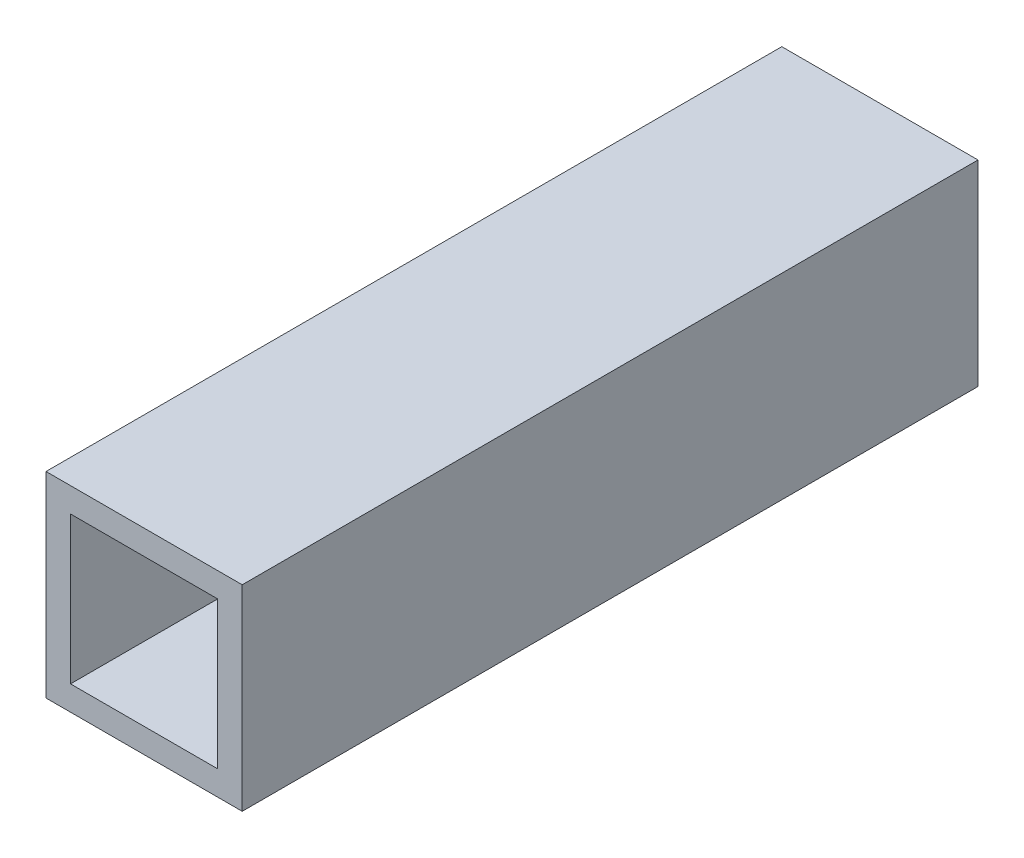
ISO-10303-21;
HEADER;
FILE_DESCRIPTION(('STEP AP214'),'2;1');
FILE_NAME('part.step','',(''),(''),'','','');
FILE_SCHEMA(('AUTOMOTIVE_DESIGN { 1 0 10303 214 1 1 1 1 }'));
ENDSEC;
DATA;
#1=APPLICATION_CONTEXT('core data for automotive mechanical design processes');
#2=APPLICATION_PROTOCOL_DEFINITION('international standard','automotive_design',2000,#1);
#3=PRODUCT_CONTEXT('',#1,'mechanical');
#4=PRODUCT('Part','Part','',(#3));
#5=PRODUCT_RELATED_PRODUCT_CATEGORY('part','',(#4));
#6=PRODUCT_DEFINITION_FORMATION('','',#4);
#7=PRODUCT_DEFINITION_CONTEXT('part definition',#1,'design');
#8=PRODUCT_DEFINITION('design','',#6,#7);
#9=PRODUCT_DEFINITION_SHAPE('','',#8);
#10=(LENGTH_UNIT() NAMED_UNIT(*) SI_UNIT(.MILLI.,.METRE.));
#11=(NAMED_UNIT(*) PLANE_ANGLE_UNIT() SI_UNIT($,.RADIAN.));
#12=(NAMED_UNIT(*) SI_UNIT($,.STERADIAN.) SOLID_ANGLE_UNIT());
#13=UNCERTAINTY_MEASURE_WITH_UNIT(LENGTH_MEASURE(1.E-05),#10,'distance_accuracy_value','');
#14=(GEOMETRIC_REPRESENTATION_CONTEXT(3) GLOBAL_UNCERTAINTY_ASSIGNED_CONTEXT((#13)) GLOBAL_UNIT_ASSIGNED_CONTEXT((#10,
#11,#12)) REPRESENTATION_CONTEXT('',''));
#15=CARTESIAN_POINT('',(0.,0.,0.));
#16=DIRECTION('',(0.,0.,1.));
#17=DIRECTION('',(1.,0.,0.));
#18=AXIS2_PLACEMENT_3D('',#15,#16,#17);
#19=CARTESIAN_POINT('',(0.,0.,95.25));
#20=DIRECTION('',(0.,0.,1.));
#21=DIRECTION('',(1.,0.,0.));
#22=AXIS2_PLACEMENT_3D('',#19,#20,#21);
#23=PLANE('',#22);
#24=DIRECTION('',(0.,-1.,0.));
#25=VECTOR('',#24,1.);
#26=CARTESIAN_POINT('',(-12.7,-12.7,95.25));
#27=LINE('',#26,#25);
#28=CARTESIAN_POINT('',(-12.7,12.7,95.25));
#29=VERTEX_POINT('',#28);
#30=CARTESIAN_POINT('',(-12.7,-12.7,95.25));
#31=VERTEX_POINT('',#30);
#32=EDGE_CURVE('E133',#29,#31,#27,.T.);
#33=ORIENTED_EDGE('',*,*,#32,.T.);
#34=DIRECTION('',(1.,0.,0.));
#35=VECTOR('',#34,1.);
#36=CARTESIAN_POINT('',(12.7,-12.7,95.25));
#37=LINE('',#36,#35);
#38=CARTESIAN_POINT('',(12.7,-12.7,95.25));
#39=VERTEX_POINT('',#38);
#40=EDGE_CURVE('E136',#31,#39,#37,.T.);
#41=ORIENTED_EDGE('',*,*,#40,.T.);
#42=DIRECTION('',(0.,1.,0.));
#43=VECTOR('',#42,1.);
#44=CARTESIAN_POINT('',(12.7,-12.7,95.25));
#45=LINE('',#44,#43);
#46=CARTESIAN_POINT('',(12.7,12.7,95.25));
#47=VERTEX_POINT('',#46);
#48=EDGE_CURVE('E139',#39,#47,#45,.T.);
#49=ORIENTED_EDGE('',*,*,#48,.T.);
#50=DIRECTION('',(-1.,0.,0.));
#51=VECTOR('',#50,1.);
#52=CARTESIAN_POINT('',(12.7,12.7,95.25));
#53=LINE('',#52,#51);
#54=EDGE_CURVE('E141',#47,#29,#53,.T.);
#55=ORIENTED_EDGE('',*,*,#54,.T.);
#56=EDGE_LOOP('',(#33,#41,#49,#55));
#57=FACE_BOUND('',#56,.T.);
#58=DIRECTION('',(1.,0.,0.));
#59=VECTOR('',#58,1.);
#60=CARTESIAN_POINT('',(9.525,-9.525,95.25));
#61=LINE('',#60,#59);
#62=CARTESIAN_POINT('',(-9.525,-9.525,95.25));
#63=VERTEX_POINT('',#62);
#64=CARTESIAN_POINT('',(9.525,-9.525,95.25));
#65=VERTEX_POINT('',#64);
#66=EDGE_CURVE('E105',#63,#65,#61,.T.);
#67=ORIENTED_EDGE('',*,*,#66,.F.);
#68=DIRECTION('',(0.,-1.,0.));
#69=VECTOR('',#68,1.);
#70=CARTESIAN_POINT('',(-9.525,-9.525,95.25));
#71=LINE('',#70,#69);
#72=CARTESIAN_POINT('',(-9.525,9.525,95.25));
#73=VERTEX_POINT('',#72);
#74=EDGE_CURVE('E97',#73,#63,#71,.T.);
#75=ORIENTED_EDGE('',*,*,#74,.F.);
#76=DIRECTION('',(-1.,0.,0.));
#77=VECTOR('',#76,1.);
#78=CARTESIAN_POINT('',(9.525,9.525,95.25));
#79=LINE('',#78,#77);
#80=CARTESIAN_POINT('',(9.525,9.525,95.25));
#81=VERTEX_POINT('',#80);
#82=EDGE_CURVE('E119',#81,#73,#79,.T.);
#83=ORIENTED_EDGE('',*,*,#82,.F.);
#84=DIRECTION('',(0.,1.,0.));
#85=VECTOR('',#84,1.);
#86=CARTESIAN_POINT('',(9.525,-9.525,95.25));
#87=LINE('',#86,#85);
#88=EDGE_CURVE('E117',#65,#81,#87,.T.);
#89=ORIENTED_EDGE('',*,*,#88,.F.);
#90=EDGE_LOOP('',(#67,#75,#83,#89));
#91=FACE_BOUND('',#90,.T.);
#92=ADVANCED_FACE('F32',(#57,#91),#23,.T.);
#93=CARTESIAN_POINT('',(0.,0.,0.));
#94=DIRECTION('',(0.,0.,1.));
#95=DIRECTION('',(1.,0.,0.));
#96=AXIS2_PLACEMENT_3D('',#93,#94,#95);
#97=PLANE('',#96);
#98=DIRECTION('',(0.,-1.,0.));
#99=VECTOR('',#98,1.);
#100=CARTESIAN_POINT('',(-12.7,-12.7,0.));
#101=LINE('',#100,#99);
#102=CARTESIAN_POINT('',(-12.7,12.7,0.));
#103=VERTEX_POINT('',#102);
#104=CARTESIAN_POINT('',(-12.7,-12.7,0.));
#105=VERTEX_POINT('',#104);
#106=EDGE_CURVE('E113',#103,#105,#101,.T.);
#107=ORIENTED_EDGE('',*,*,#106,.F.);
#108=DIRECTION('',(-1.,0.,0.));
#109=VECTOR('',#108,1.);
#110=CARTESIAN_POINT('',(12.7,12.7,0.));
#111=LINE('',#110,#109);
#112=CARTESIAN_POINT('',(12.7,12.7,0.));
#113=VERTEX_POINT('',#112);
#114=EDGE_CURVE('E137',#113,#103,#111,.T.);
#115=ORIENTED_EDGE('',*,*,#114,.F.);
#116=DIRECTION('',(0.,1.,0.));
#117=VECTOR('',#116,1.);
#118=CARTESIAN_POINT('',(12.7,-12.7,0.));
#119=LINE('',#118,#117);
#120=CARTESIAN_POINT('',(12.7,-12.7,0.));
#121=VERTEX_POINT('',#120);
#122=EDGE_CURVE('E148',#121,#113,#119,.T.);
#123=ORIENTED_EDGE('',*,*,#122,.F.);
#124=DIRECTION('',(1.,0.,0.));
#125=VECTOR('',#124,1.);
#126=CARTESIAN_POINT('',(12.7,-12.7,0.));
#127=LINE('',#126,#125);
#128=EDGE_CURVE('E146',#105,#121,#127,.T.);
#129=ORIENTED_EDGE('',*,*,#128,.F.);
#130=EDGE_LOOP('',(#107,#115,#123,#129));
#131=FACE_BOUND('',#130,.T.);
#132=DIRECTION('',(0.,-1.,0.));
#133=VECTOR('',#132,1.);
#134=CARTESIAN_POINT('',(-9.525,-9.525,0.));
#135=LINE('',#134,#133);
#136=CARTESIAN_POINT('',(-9.525,9.525,0.));
#137=VERTEX_POINT('',#136);
#138=CARTESIAN_POINT('',(-9.525,-9.525,0.));
#139=VERTEX_POINT('',#138);
#140=EDGE_CURVE('E55',#137,#139,#135,.T.);
#141=ORIENTED_EDGE('',*,*,#140,.T.);
#142=DIRECTION('',(1.,0.,0.));
#143=VECTOR('',#142,1.);
#144=CARTESIAN_POINT('',(9.525,-9.525,0.));
#145=LINE('',#144,#143);
#146=CARTESIAN_POINT('',(9.525,-9.525,0.));
#147=VERTEX_POINT('',#146);
#148=EDGE_CURVE('E112',#139,#147,#145,.T.);
#149=ORIENTED_EDGE('',*,*,#148,.T.);
#150=DIRECTION('',(0.,1.,0.));
#151=VECTOR('',#150,1.);
#152=CARTESIAN_POINT('',(9.525,-9.525,0.));
#153=LINE('',#152,#151);
#154=CARTESIAN_POINT('',(9.525,9.525,0.));
#155=VERTEX_POINT('',#154);
#156=EDGE_CURVE('E125',#147,#155,#153,.T.);
#157=ORIENTED_EDGE('',*,*,#156,.T.);
#158=DIRECTION('',(-1.,0.,0.));
#159=VECTOR('',#158,1.);
#160=CARTESIAN_POINT('',(9.525,9.525,0.));
#161=LINE('',#160,#159);
#162=EDGE_CURVE('E106',#155,#137,#161,.T.);
#163=ORIENTED_EDGE('',*,*,#162,.T.);
#164=EDGE_LOOP('',(#141,#149,#157,#163));
#165=FACE_BOUND('',#164,.T.);
#166=ADVANCED_FACE('F166',(#131,#165),#97,.F.);
#167=CARTESIAN_POINT('',(-12.7,-12.7,95.25));
#168=DIRECTION('',(1.,0.,0.));
#169=DIRECTION('',(0.,1.,0.));
#170=AXIS2_PLACEMENT_3D('',#167,#168,#169);
#171=PLANE('',#170);
#172=ORIENTED_EDGE('',*,*,#106,.T.);
#173=DIRECTION('',(0.,0.,-1.));
#174=VECTOR('',#173,1.);
#175=CARTESIAN_POINT('',(-12.7,-12.7,95.25));
#176=LINE('',#175,#174);
#177=EDGE_CURVE('E11',#31,#105,#176,.T.);
#178=ORIENTED_EDGE('',*,*,#177,.F.);
#179=ORIENTED_EDGE('',*,*,#32,.F.);
#180=DIRECTION('',(0.,0.,-1.));
#181=VECTOR('',#180,1.);
#182=CARTESIAN_POINT('',(-12.7,12.7,95.25));
#183=LINE('',#182,#181);
#184=EDGE_CURVE('E143',#29,#103,#183,.T.);
#185=ORIENTED_EDGE('',*,*,#184,.T.);
#186=EDGE_LOOP('',(#172,#178,#179,#185));
#187=FACE_BOUND('',#186,.T.);
#188=ADVANCED_FACE('F34',(#187),#171,.F.);
#189=CARTESIAN_POINT('',(12.7,-12.7,95.25));
#190=DIRECTION('',(0.,1.,0.));
#191=DIRECTION('',(0.,0.,1.));
#192=AXIS2_PLACEMENT_3D('',#189,#190,#191);
#193=PLANE('',#192);
#194=ORIENTED_EDGE('',*,*,#128,.T.);
#195=DIRECTION('',(0.,0.,-1.));
#196=VECTOR('',#195,1.);
#197=CARTESIAN_POINT('',(12.7,-12.7,95.25));
#198=LINE('',#197,#196);
#199=EDGE_CURVE('E40',#39,#121,#198,.T.);
#200=ORIENTED_EDGE('',*,*,#199,.F.);
#201=ORIENTED_EDGE('',*,*,#40,.F.);
#202=ORIENTED_EDGE('',*,*,#177,.T.);
#203=EDGE_LOOP('',(#194,#200,#201,#202));
#204=FACE_BOUND('',#203,.T.);
#205=ADVANCED_FACE('F176',(#204),#193,.F.);
#206=CARTESIAN_POINT('',(12.7,-12.7,95.25));
#207=DIRECTION('',(-1.,0.,0.));
#208=DIRECTION('',(0.,0.,1.));
#209=AXIS2_PLACEMENT_3D('',#206,#207,#208);
#210=PLANE('',#209);
#211=ORIENTED_EDGE('',*,*,#122,.T.);
#212=DIRECTION('',(0.,0.,-1.));
#213=VECTOR('',#212,1.);
#214=CARTESIAN_POINT('',(12.7,12.7,95.25));
#215=LINE('',#214,#213);
#216=EDGE_CURVE('E153',#47,#113,#215,.T.);
#217=ORIENTED_EDGE('',*,*,#216,.F.);
#218=ORIENTED_EDGE('',*,*,#48,.F.);
#219=ORIENTED_EDGE('',*,*,#199,.T.);
#220=EDGE_LOOP('',(#211,#217,#218,#219));
#221=FACE_BOUND('',#220,.T.);
#222=ADVANCED_FACE('F160',(#221),#210,.F.);
#223=CARTESIAN_POINT('',(12.7,12.7,95.25));
#224=DIRECTION('',(0.,-1.,0.));
#225=DIRECTION('',(1.,0.,0.));
#226=AXIS2_PLACEMENT_3D('',#223,#224,#225);
#227=PLANE('',#226);
#228=ORIENTED_EDGE('',*,*,#114,.T.);
#229=ORIENTED_EDGE('',*,*,#184,.F.);
#230=ORIENTED_EDGE('',*,*,#54,.F.);
#231=ORIENTED_EDGE('',*,*,#216,.T.);
#232=EDGE_LOOP('',(#228,#229,#230,#231));
#233=FACE_BOUND('',#232,.T.);
#234=ADVANCED_FACE('F170',(#233),#227,.F.);
#235=CARTESIAN_POINT('',(-9.525,-9.525,95.25));
#236=DIRECTION('',(1.,0.,0.));
#237=DIRECTION('',(0.,0.,-1.));
#238=AXIS2_PLACEMENT_3D('',#235,#236,#237);
#239=PLANE('',#238);
#240=ORIENTED_EDGE('',*,*,#140,.F.);
#241=DIRECTION('',(0.,0.,-1.));
#242=VECTOR('',#241,1.);
#243=CARTESIAN_POINT('',(-9.525,9.525,95.25));
#244=LINE('',#243,#242);
#245=EDGE_CURVE('E101',#73,#137,#244,.T.);
#246=ORIENTED_EDGE('',*,*,#245,.F.);
#247=ORIENTED_EDGE('',*,*,#74,.T.);
#248=DIRECTION('',(0.,0.,-1.));
#249=VECTOR('',#248,1.);
#250=CARTESIAN_POINT('',(-9.525,-9.525,95.25));
#251=LINE('',#250,#249);
#252=EDGE_CURVE('E100',#63,#139,#251,.T.);
#253=ORIENTED_EDGE('',*,*,#252,.T.);
#254=EDGE_LOOP('',(#240,#246,#247,#253));
#255=FACE_BOUND('',#254,.T.);
#256=ADVANCED_FACE('F99',(#255),#239,.T.);
#257=CARTESIAN_POINT('',(9.525,-9.525,95.25));
#258=DIRECTION('',(0.,1.,0.));
#259=DIRECTION('',(0.,0.,1.));
#260=AXIS2_PLACEMENT_3D('',#257,#258,#259);
#261=PLANE('',#260);
#262=ORIENTED_EDGE('',*,*,#148,.F.);
#263=ORIENTED_EDGE('',*,*,#252,.F.);
#264=ORIENTED_EDGE('',*,*,#66,.T.);
#265=DIRECTION('',(0.,0.,-1.));
#266=VECTOR('',#265,1.);
#267=CARTESIAN_POINT('',(9.525,-9.525,95.25));
#268=LINE('',#267,#266);
#269=EDGE_CURVE('E114',#65,#147,#268,.T.);
#270=ORIENTED_EDGE('',*,*,#269,.T.);
#271=EDGE_LOOP('',(#262,#263,#264,#270));
#272=FACE_BOUND('',#271,.T.);
#273=ADVANCED_FACE('F109',(#272),#261,.T.);
#274=CARTESIAN_POINT('',(9.525,-9.525,95.25));
#275=DIRECTION('',(-1.,0.,0.));
#276=DIRECTION('',(0.,0.,1.));
#277=AXIS2_PLACEMENT_3D('',#274,#275,#276);
#278=PLANE('',#277);
#279=ORIENTED_EDGE('',*,*,#156,.F.);
#280=ORIENTED_EDGE('',*,*,#269,.F.);
#281=ORIENTED_EDGE('',*,*,#88,.T.);
#282=DIRECTION('',(0.,0.,-1.));
#283=VECTOR('',#282,1.);
#284=CARTESIAN_POINT('',(9.525,9.525,95.25));
#285=LINE('',#284,#283);
#286=EDGE_CURVE('E47',#81,#155,#285,.T.);
#287=ORIENTED_EDGE('',*,*,#286,.T.);
#288=EDGE_LOOP('',(#279,#280,#281,#287));
#289=FACE_BOUND('',#288,.T.);
#290=ADVANCED_FACE('F199',(#289),#278,.T.);
#291=CARTESIAN_POINT('',(9.525,9.525,95.25));
#292=DIRECTION('',(0.,-1.,0.));
#293=DIRECTION('',(0.,0.,-1.));
#294=AXIS2_PLACEMENT_3D('',#291,#292,#293);
#295=PLANE('',#294);
#296=ORIENTED_EDGE('',*,*,#162,.F.);
#297=ORIENTED_EDGE('',*,*,#286,.F.);
#298=ORIENTED_EDGE('',*,*,#82,.T.);
#299=ORIENTED_EDGE('',*,*,#245,.T.);
#300=EDGE_LOOP('',(#296,#297,#298,#299));
#301=FACE_BOUND('',#300,.T.);
#302=ADVANCED_FACE('F203',(#301),#295,.T.);
#303=CLOSED_SHELL('',(#92,#166,#188,#205,#222,#234,#256,#273,#290,#302));
#304=MANIFOLD_SOLID_BREP('B2',#303);
#305=ADVANCED_BREP_SHAPE_REPRESENTATION('',(#18,#304),#14);
#306=SHAPE_DEFINITION_REPRESENTATION(#9,#305);
ENDSEC;
END-ISO-10303-21;
